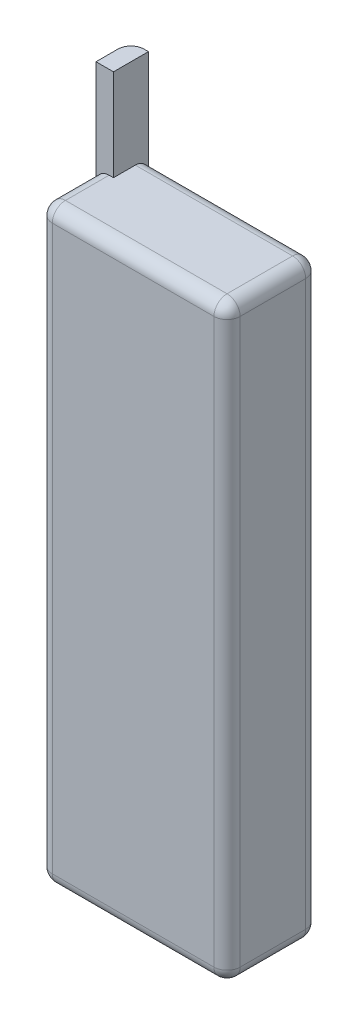
ISO-10303-21;
HEADER;
FILE_DESCRIPTION(('STEP AP214'),'2;1');
FILE_NAME('part.step','',(''),(''),'','','');
FILE_SCHEMA(('AUTOMOTIVE_DESIGN { 1 0 10303 214 1 1 1 1 }'));
ENDSEC;
DATA;
#1=APPLICATION_CONTEXT('core data for automotive mechanical design processes');
#2=APPLICATION_PROTOCOL_DEFINITION('international standard','automotive_design',2000,#1);
#3=PRODUCT_CONTEXT('',#1,'mechanical');
#4=PRODUCT('Part','Part','',(#3));
#5=PRODUCT_RELATED_PRODUCT_CATEGORY('part','',(#4));
#6=PRODUCT_DEFINITION_FORMATION('','',#4);
#7=PRODUCT_DEFINITION_CONTEXT('part definition',#1,'design');
#8=PRODUCT_DEFINITION('design','',#6,#7);
#9=PRODUCT_DEFINITION_SHAPE('','',#8);
#10=(LENGTH_UNIT() NAMED_UNIT(*) SI_UNIT(.MILLI.,.METRE.));
#11=(NAMED_UNIT(*) PLANE_ANGLE_UNIT() SI_UNIT($,.RADIAN.));
#12=(NAMED_UNIT(*) SI_UNIT($,.STERADIAN.) SOLID_ANGLE_UNIT());
#13=UNCERTAINTY_MEASURE_WITH_UNIT(LENGTH_MEASURE(1.E-05),#10,'distance_accuracy_value','');
#14=(GEOMETRIC_REPRESENTATION_CONTEXT(3) GLOBAL_UNCERTAINTY_ASSIGNED_CONTEXT((#13)) GLOBAL_UNIT_ASSIGNED_CONTEXT((#10,
#11,#12)) REPRESENTATION_CONTEXT('',''));
#15=CARTESIAN_POINT('',(0.,0.,0.));
#16=DIRECTION('',(0.,0.,1.));
#17=DIRECTION('',(1.,0.,0.));
#18=AXIS2_PLACEMENT_3D('',#15,#16,#17);
#19=CARTESIAN_POINT('',(0.,135.,21.));
#20=DIRECTION('',(0.,-1.,0.));
#21=DIRECTION('',(0.,0.,-1.));
#22=AXIS2_PLACEMENT_3D('',#19,#20,#21);
#23=PLANE('',#22);
#24=DIRECTION('',(0.,0.,-1.));
#25=VECTOR('',#24,1.);
#26=CARTESIAN_POINT('',(40.,135.,21.));
#27=LINE('',#26,#25);
#28=CARTESIAN_POINT('',(40.,135.,18.));
#29=VERTEX_POINT('',#28);
#30=CARTESIAN_POINT('',(40.,135.,3.));
#31=VERTEX_POINT('',#30);
#32=EDGE_CURVE('E301',#29,#31,#27,.T.);
#33=ORIENTED_EDGE('',*,*,#32,.T.);
#34=DIRECTION('',(-1.,0.,0.));
#35=VECTOR('',#34,1.);
#36=CARTESIAN_POINT('',(4.,135.,3.));
#37=LINE('',#36,#35);
#38=CARTESIAN_POINT('',(4.,135.,3.));
#39=VERTEX_POINT('',#38);
#40=EDGE_CURVE('E304',#31,#39,#37,.T.);
#41=ORIENTED_EDGE('',*,*,#40,.T.);
#42=DIRECTION('',(0.,0.,-1.));
#43=VECTOR('',#42,1.);
#44=CARTESIAN_POINT('',(4.,135.,0.));
#45=LINE('',#44,#43);
#46=CARTESIAN_POINT('',(4.,135.,8.));
#47=VERTEX_POINT('',#46);
#48=EDGE_CURVE('E164',#47,#39,#45,.T.);
#49=ORIENTED_EDGE('',*,*,#48,.F.);
#50=DIRECTION('',(1.,0.,0.));
#51=VECTOR('',#50,1.);
#52=CARTESIAN_POINT('',(0.,135.,8.));
#53=LINE('',#52,#51);
#54=CARTESIAN_POINT('',(3.,135.,8.));
#55=VERTEX_POINT('',#54);
#56=EDGE_CURVE('E285',#55,#47,#53,.T.);
#57=ORIENTED_EDGE('',*,*,#56,.F.);
#58=DIRECTION('',(0.,0.,-1.));
#59=VECTOR('',#58,1.);
#60=CARTESIAN_POINT('',(3.,135.,21.));
#61=LINE('',#60,#59);
#62=CARTESIAN_POINT('',(3.,135.,18.));
#63=VERTEX_POINT('',#62);
#64=EDGE_CURVE('E298',#55,#63,#61,.F.);
#65=ORIENTED_EDGE('',*,*,#64,.T.);
#66=DIRECTION('',(-1.,0.,0.));
#67=VECTOR('',#66,1.);
#68=CARTESIAN_POINT('',(0.,135.,18.));
#69=LINE('',#68,#67);
#70=EDGE_CURVE('E295',#63,#29,#69,.F.);
#71=ORIENTED_EDGE('',*,*,#70,.T.);
#72=EDGE_LOOP('',(#33,#41,#49,#57,#65,#71));
#73=FACE_BOUND('',#72,.T.);
#74=ADVANCED_FACE('F41',(#73),#23,.F.);
#75=CARTESIAN_POINT('',(0.,0.,21.));
#76=DIRECTION('',(1.,0.,0.));
#77=DIRECTION('',(0.,0.,-1.));
#78=AXIS2_PLACEMENT_3D('',#75,#76,#77);
#79=PLANE('',#78);
#80=DIRECTION('',(0.,-1.,0.));
#81=VECTOR('',#80,1.);
#82=CARTESIAN_POINT('',(0.,0.,18.));
#83=LINE('',#82,#81);
#84=CARTESIAN_POINT('',(0.,3.,18.));
#85=VERTEX_POINT('',#84);
#86=CARTESIAN_POINT('',(0.,132.,18.));
#87=VERTEX_POINT('',#86);
#88=EDGE_CURVE('E197',#85,#87,#83,.F.);
#89=ORIENTED_EDGE('',*,*,#88,.T.);
#90=DIRECTION('',(0.,0.,-1.));
#91=VECTOR('',#90,1.);
#92=CARTESIAN_POINT('',(0.,132.,21.));
#93=LINE('',#92,#91);
#94=CARTESIAN_POINT('',(0.,132.,8.));
#95=VERTEX_POINT('',#94);
#96=EDGE_CURVE('E176',#87,#95,#93,.T.);
#97=ORIENTED_EDGE('',*,*,#96,.T.);
#98=DIRECTION('',(0.,-1.,0.));
#99=VECTOR('',#98,1.);
#100=CARTESIAN_POINT('',(0.,156.,8.));
#101=LINE('',#100,#99);
#102=CARTESIAN_POINT('',(0.,156.,8.));
#103=VERTEX_POINT('',#102);
#104=EDGE_CURVE('E58',#103,#95,#101,.T.);
#105=ORIENTED_EDGE('',*,*,#104,.F.);
#106=DIRECTION('',(0.,0.,1.));
#107=VECTOR('',#106,1.);
#108=CARTESIAN_POINT('',(0.,156.,0.));
#109=LINE('',#108,#107);
#110=CARTESIAN_POINT('',(0.,156.,3.));
#111=VERTEX_POINT('',#110);
#112=EDGE_CURVE('E154',#111,#103,#109,.T.);
#113=ORIENTED_EDGE('',*,*,#112,.F.);
#114=DIRECTION('',(0.,-1.,0.));
#115=VECTOR('',#114,1.);
#116=CARTESIAN_POINT('',(0.,0.,3.));
#117=LINE('',#116,#115);
#118=CARTESIAN_POINT('',(0.,3.,3.));
#119=VERTEX_POINT('',#118);
#120=EDGE_CURVE('E204',#111,#119,#117,.T.);
#121=ORIENTED_EDGE('',*,*,#120,.T.);
#122=DIRECTION('',(0.,0.,-1.));
#123=VECTOR('',#122,1.);
#124=CARTESIAN_POINT('',(0.,3.,21.));
#125=LINE('',#124,#123);
#126=EDGE_CURVE('E200',#119,#85,#125,.F.);
#127=ORIENTED_EDGE('',*,*,#126,.T.);
#128=EDGE_LOOP('',(#89,#97,#105,#113,#121,#127));
#129=FACE_BOUND('',#128,.T.);
#130=ADVANCED_FACE('F174',(#129),#79,.F.);
#131=CARTESIAN_POINT('',(0.,0.,21.));
#132=DIRECTION('',(0.,1.,0.));
#133=DIRECTION('',(0.,0.,1.));
#134=AXIS2_PLACEMENT_3D('',#131,#132,#133);
#135=PLANE('',#134);
#136=DIRECTION('',(1.,0.,0.));
#137=VECTOR('',#136,1.);
#138=CARTESIAN_POINT('',(0.,0.,18.));
#139=LINE('',#138,#137);
#140=CARTESIAN_POINT('',(40.,0.,18.));
#141=VERTEX_POINT('',#140);
#142=CARTESIAN_POINT('',(3.,0.,18.));
#143=VERTEX_POINT('',#142);
#144=EDGE_CURVE('E190',#141,#143,#139,.F.);
#145=ORIENTED_EDGE('',*,*,#144,.T.);
#146=DIRECTION('',(0.,0.,-1.));
#147=VECTOR('',#146,1.);
#148=CARTESIAN_POINT('',(3.,0.,21.));
#149=LINE('',#148,#147);
#150=CARTESIAN_POINT('',(3.,0.,3.));
#151=VERTEX_POINT('',#150);
#152=EDGE_CURVE('E193',#143,#151,#149,.T.);
#153=ORIENTED_EDGE('',*,*,#152,.T.);
#154=DIRECTION('',(1.,0.,0.));
#155=VECTOR('',#154,1.);
#156=CARTESIAN_POINT('',(43.,0.,3.));
#157=LINE('',#156,#155);
#158=CARTESIAN_POINT('',(40.,0.,3.));
#159=VERTEX_POINT('',#158);
#160=EDGE_CURVE('E179',#151,#159,#157,.T.);
#161=ORIENTED_EDGE('',*,*,#160,.T.);
#162=DIRECTION('',(0.,0.,-1.));
#163=VECTOR('',#162,1.);
#164=CARTESIAN_POINT('',(40.,0.,21.));
#165=LINE('',#164,#163);
#166=EDGE_CURVE('E183',#159,#141,#165,.F.);
#167=ORIENTED_EDGE('',*,*,#166,.T.);
#168=EDGE_LOOP('',(#145,#153,#161,#167));
#169=FACE_BOUND('',#168,.T.);
#170=ADVANCED_FACE('F452',(#169),#135,.F.);
#171=CARTESIAN_POINT('',(43.,0.,21.));
#172=DIRECTION('',(-1.,0.,0.));
#173=DIRECTION('',(0.,0.,1.));
#174=AXIS2_PLACEMENT_3D('',#171,#172,#173);
#175=PLANE('',#174);
#176=DIRECTION('',(0.,1.,0.));
#177=VECTOR('',#176,1.);
#178=CARTESIAN_POINT('',(43.,135.,3.));
#179=LINE('',#178,#177);
#180=CARTESIAN_POINT('',(43.,3.,3.));
#181=VERTEX_POINT('',#180);
#182=CARTESIAN_POINT('',(43.,132.,3.));
#183=VERTEX_POINT('',#182);
#184=EDGE_CURVE('E223',#181,#183,#179,.T.);
#185=ORIENTED_EDGE('',*,*,#184,.T.);
#186=DIRECTION('',(0.,0.,-1.));
#187=VECTOR('',#186,1.);
#188=CARTESIAN_POINT('',(43.,132.,21.));
#189=LINE('',#188,#187);
#190=CARTESIAN_POINT('',(43.,132.,18.));
#191=VERTEX_POINT('',#190);
#192=EDGE_CURVE('E310',#183,#191,#189,.F.);
#193=ORIENTED_EDGE('',*,*,#192,.T.);
#194=DIRECTION('',(0.,1.,0.));
#195=VECTOR('',#194,1.);
#196=CARTESIAN_POINT('',(43.,0.,18.));
#197=LINE('',#196,#195);
#198=CARTESIAN_POINT('',(43.,3.,18.));
#199=VERTEX_POINT('',#198);
#200=EDGE_CURVE('E217',#191,#199,#197,.F.);
#201=ORIENTED_EDGE('',*,*,#200,.T.);
#202=DIRECTION('',(0.,0.,-1.));
#203=VECTOR('',#202,1.);
#204=CARTESIAN_POINT('',(43.,3.,21.));
#205=LINE('',#204,#203);
#206=EDGE_CURVE('E220',#199,#181,#205,.T.);
#207=ORIENTED_EDGE('',*,*,#206,.T.);
#208=EDGE_LOOP('',(#185,#193,#201,#207));
#209=FACE_BOUND('',#208,.T.);
#210=ADVANCED_FACE('F431',(#209),#175,.F.);
#211=CARTESIAN_POINT('',(0.,0.,21.));
#212=DIRECTION('',(0.,0.,-1.));
#213=DIRECTION('',(-1.,0.,0.));
#214=AXIS2_PLACEMENT_3D('',#211,#212,#213);
#215=PLANE('',#214);
#216=DIRECTION('',(0.,1.,0.));
#217=VECTOR('',#216,1.);
#218=CARTESIAN_POINT('',(40.,0.,21.));
#219=LINE('',#218,#217);
#220=CARTESIAN_POINT('',(40.,3.,21.));
#221=VERTEX_POINT('',#220);
#222=CARTESIAN_POINT('',(40.,132.,21.));
#223=VERTEX_POINT('',#222);
#224=EDGE_CURVE('E207',#221,#223,#219,.T.);
#225=ORIENTED_EDGE('',*,*,#224,.T.);
#226=DIRECTION('',(-1.,0.,0.));
#227=VECTOR('',#226,1.);
#228=CARTESIAN_POINT('',(0.,132.,21.));
#229=LINE('',#228,#227);
#230=CARTESIAN_POINT('',(3.,132.,21.));
#231=VERTEX_POINT('',#230);
#232=EDGE_CURVE('E315',#223,#231,#229,.T.);
#233=ORIENTED_EDGE('',*,*,#232,.T.);
#234=DIRECTION('',(0.,-1.,0.));
#235=VECTOR('',#234,1.);
#236=CARTESIAN_POINT('',(3.,0.,21.));
#237=LINE('',#236,#235);
#238=CARTESIAN_POINT('',(3.,3.,21.));
#239=VERTEX_POINT('',#238);
#240=EDGE_CURVE('E214',#231,#239,#237,.T.);
#241=ORIENTED_EDGE('',*,*,#240,.T.);
#242=DIRECTION('',(1.,0.,0.));
#243=VECTOR('',#242,1.);
#244=CARTESIAN_POINT('',(0.,3.,21.));
#245=LINE('',#244,#243);
#246=EDGE_CURVE('E211',#239,#221,#245,.T.);
#247=ORIENTED_EDGE('',*,*,#246,.T.);
#248=EDGE_LOOP('',(#225,#233,#241,#247));
#249=FACE_BOUND('',#248,.T.);
#250=ADVANCED_FACE('F392',(#249),#215,.F.);
#251=CARTESIAN_POINT('',(0.,0.,0.));
#252=DIRECTION('',(0.,0.,-1.));
#253=DIRECTION('',(-1.,0.,0.));
#254=AXIS2_PLACEMENT_3D('',#251,#252,#253);
#255=PLANE('',#254);
#256=DIRECTION('',(0.,-1.,0.));
#257=VECTOR('',#256,1.);
#258=CARTESIAN_POINT('',(4.,156.,0.));
#259=LINE('',#258,#257);
#260=CARTESIAN_POINT('',(4.,156.,0.));
#261=VERTEX_POINT('',#260);
#262=CARTESIAN_POINT('',(4.,132.,0.));
#263=VERTEX_POINT('',#262);
#264=EDGE_CURVE('E66',#261,#263,#259,.T.);
#265=ORIENTED_EDGE('',*,*,#264,.T.);
#266=DIRECTION('',(-1.,0.,0.));
#267=VECTOR('',#266,1.);
#268=CARTESIAN_POINT('',(40.,132.,0.));
#269=LINE('',#268,#267);
#270=CARTESIAN_POINT('',(40.,132.,0.));
#271=VERTEX_POINT('',#270);
#272=EDGE_CURVE('E307',#263,#271,#269,.F.);
#273=ORIENTED_EDGE('',*,*,#272,.T.);
#274=DIRECTION('',(0.,1.,0.));
#275=VECTOR('',#274,1.);
#276=CARTESIAN_POINT('',(40.,0.,0.));
#277=LINE('',#276,#275);
#278=CARTESIAN_POINT('',(40.,3.,0.));
#279=VERTEX_POINT('',#278);
#280=EDGE_CURVE('E227',#271,#279,#277,.F.);
#281=ORIENTED_EDGE('',*,*,#280,.T.);
#282=DIRECTION('',(1.,0.,0.));
#283=VECTOR('',#282,1.);
#284=CARTESIAN_POINT('',(0.,3.,0.));
#285=LINE('',#284,#283);
#286=CARTESIAN_POINT('',(3.,3.,0.));
#287=VERTEX_POINT('',#286);
#288=EDGE_CURVE('E230',#279,#287,#285,.F.);
#289=ORIENTED_EDGE('',*,*,#288,.T.);
#290=DIRECTION('',(0.,-1.,0.));
#291=VECTOR('',#290,1.);
#292=CARTESIAN_POINT('',(3.,156.,0.));
#293=LINE('',#292,#291);
#294=CARTESIAN_POINT('',(3.,156.,0.));
#295=VERTEX_POINT('',#294);
#296=EDGE_CURVE('E233',#287,#295,#293,.F.);
#297=ORIENTED_EDGE('',*,*,#296,.T.);
#298=DIRECTION('',(-1.,0.,0.));
#299=VECTOR('',#298,1.);
#300=CARTESIAN_POINT('',(0.,156.,0.));
#301=LINE('',#300,#299);
#302=EDGE_CURVE('E358',#261,#295,#301,.T.);
#303=ORIENTED_EDGE('',*,*,#302,.F.);
#304=EDGE_LOOP('',(#265,#273,#281,#289,#297,#303));
#305=FACE_BOUND('',#304,.T.);
#306=ADVANCED_FACE('F367',(#305),#255,.T.);
#307=CARTESIAN_POINT('',(0.,156.,8.));
#308=DIRECTION('',(0.,0.,-1.));
#309=DIRECTION('',(-1.,0.,0.));
#310=AXIS2_PLACEMENT_3D('',#307,#308,#309);
#311=PLANE('',#310);
#312=ORIENTED_EDGE('',*,*,#104,.T.);
#313=CARTESIAN_POINT('',(3.,132.,8.));
#314=DIRECTION('',(0.,0.,-1.));
#315=DIRECTION('',(-1.,0.,0.));
#316=AXIS2_PLACEMENT_3D('',#313,#314,#315);
#317=CIRCLE('',#316,3.);
#318=EDGE_CURVE('E11',#95,#55,#317,.T.);
#319=ORIENTED_EDGE('',*,*,#318,.T.);
#320=ORIENTED_EDGE('',*,*,#56,.T.);
#321=DIRECTION('',(0.,-1.,0.));
#322=VECTOR('',#321,1.);
#323=CARTESIAN_POINT('',(4.,156.,8.));
#324=LINE('',#323,#322);
#325=CARTESIAN_POINT('',(4.,156.,8.));
#326=VERTEX_POINT('',#325);
#327=EDGE_CURVE('E168',#326,#47,#324,.T.);
#328=ORIENTED_EDGE('',*,*,#327,.F.);
#329=DIRECTION('',(1.,0.,0.));
#330=VECTOR('',#329,1.);
#331=CARTESIAN_POINT('',(0.,156.,8.));
#332=LINE('',#331,#330);
#333=EDGE_CURVE('E157',#103,#326,#332,.T.);
#334=ORIENTED_EDGE('',*,*,#333,.F.);
#335=EDGE_LOOP('',(#312,#319,#320,#328,#334));
#336=FACE_BOUND('',#335,.T.);
#337=ADVANCED_FACE('F166',(#336),#311,.F.);
#338=CARTESIAN_POINT('',(4.,156.,0.));
#339=DIRECTION('',(-1.,0.,0.));
#340=DIRECTION('',(0.,0.,1.));
#341=AXIS2_PLACEMENT_3D('',#338,#339,#340);
#342=PLANE('',#341);
#343=ORIENTED_EDGE('',*,*,#48,.T.);
#344=CARTESIAN_POINT('',(4.,132.,3.));
#345=DIRECTION('',(-1.,0.,0.));
#346=DIRECTION('',(0.,0.,1.));
#347=AXIS2_PLACEMENT_3D('',#344,#345,#346);
#348=CIRCLE('',#347,3.);
#349=EDGE_CURVE('E51',#39,#263,#348,.T.);
#350=ORIENTED_EDGE('',*,*,#349,.T.);
#351=ORIENTED_EDGE('',*,*,#264,.F.);
#352=DIRECTION('',(0.,0.,-1.));
#353=VECTOR('',#352,1.);
#354=CARTESIAN_POINT('',(4.,156.,0.));
#355=LINE('',#354,#353);
#356=EDGE_CURVE('E171',#326,#261,#355,.T.);
#357=ORIENTED_EDGE('',*,*,#356,.F.);
#358=ORIENTED_EDGE('',*,*,#327,.T.);
#359=EDGE_LOOP('',(#343,#350,#351,#357,#358));
#360=FACE_BOUND('',#359,.T.);
#361=ADVANCED_FACE('F364',(#360),#342,.F.);
#362=CARTESIAN_POINT('',(0.,156.,0.));
#363=DIRECTION('',(0.,1.,0.));
#364=DIRECTION('',(0.,0.,1.));
#365=AXIS2_PLACEMENT_3D('',#362,#363,#364);
#366=PLANE('',#365);
#367=ORIENTED_EDGE('',*,*,#302,.T.);
#368=CARTESIAN_POINT('',(3.,156.,3.));
#369=DIRECTION('',(0.,1.,0.));
#370=DIRECTION('',(0.,0.,1.));
#371=AXIS2_PLACEMENT_3D('',#368,#369,#370);
#372=CIRCLE('',#371,3.);
#373=EDGE_CURVE('E160',#295,#111,#372,.T.);
#374=ORIENTED_EDGE('',*,*,#373,.T.);
#375=ORIENTED_EDGE('',*,*,#112,.T.);
#376=ORIENTED_EDGE('',*,*,#333,.T.);
#377=ORIENTED_EDGE('',*,*,#356,.T.);
#378=EDGE_LOOP('',(#367,#374,#375,#376,#377));
#379=FACE_BOUND('',#378,.T.);
#380=ADVANCED_FACE('F156',(#379),#366,.T.);
#381=CARTESIAN_POINT('',(40.,0.,18.));
#382=DIRECTION('',(0.,1.,0.));
#383=DIRECTION('',(0.,0.,1.));
#384=AXIS2_PLACEMENT_3D('',#381,#382,#383);
#385=CYLINDRICAL_SURFACE('',#384,3.);
#386=ORIENTED_EDGE('',*,*,#200,.F.);
#387=CARTESIAN_POINT('',(40.,132.,18.));
#388=DIRECTION('',(0.,1.,0.));
#389=DIRECTION('',(0.,0.,1.));
#390=AXIS2_PLACEMENT_3D('',#387,#388,#389);
#391=CIRCLE('',#390,3.);
#392=EDGE_CURVE('E289',#191,#223,#391,.F.);
#393=ORIENTED_EDGE('',*,*,#392,.T.);
#394=ORIENTED_EDGE('',*,*,#224,.F.);
#395=CARTESIAN_POINT('',(40.,3.,18.));
#396=DIRECTION('',(0.,-1.,0.));
#397=DIRECTION('',(0.,0.,-1.));
#398=AXIS2_PLACEMENT_3D('',#395,#396,#397);
#399=CIRCLE('',#398,3.);
#400=EDGE_CURVE('E281',#199,#221,#399,.T.);
#401=ORIENTED_EDGE('',*,*,#400,.F.);
#402=EDGE_LOOP('',(#386,#393,#394,#401));
#403=FACE_BOUND('',#402,.T.);
#404=ADVANCED_FACE('F405',(#403),#385,.T.);
#405=CARTESIAN_POINT('',(40.,3.,21.));
#406=DIRECTION('',(0.,0.,-1.));
#407=DIRECTION('',(-1.,0.,0.));
#408=AXIS2_PLACEMENT_3D('',#405,#406,#407);
#409=CYLINDRICAL_SURFACE('',#408,3.);
#410=CARTESIAN_POINT('',(40.,3.,3.));
#411=DIRECTION('',(0.,0.,-1.));
#412=DIRECTION('',(-1.,0.,0.));
#413=AXIS2_PLACEMENT_3D('',#410,#411,#412);
#414=CIRCLE('',#413,3.);
#415=EDGE_CURVE('E273',#181,#159,#414,.T.);
#416=ORIENTED_EDGE('',*,*,#415,.F.);
#417=ORIENTED_EDGE('',*,*,#206,.F.);
#418=CARTESIAN_POINT('',(40.,3.,18.));
#419=DIRECTION('',(0.,0.,1.));
#420=DIRECTION('',(1.,0.,0.));
#421=AXIS2_PLACEMENT_3D('',#418,#419,#420);
#422=CIRCLE('',#421,3.);
#423=EDGE_CURVE('E277',#141,#199,#422,.T.);
#424=ORIENTED_EDGE('',*,*,#423,.F.);
#425=ORIENTED_EDGE('',*,*,#166,.F.);
#426=EDGE_LOOP('',(#416,#417,#424,#425));
#427=FACE_BOUND('',#426,.T.);
#428=ADVANCED_FACE('F436',(#427),#409,.T.);
#429=CARTESIAN_POINT('',(40.,0.,3.));
#430=DIRECTION('',(0.,-1.,0.));
#431=DIRECTION('',(0.,0.,-1.));
#432=AXIS2_PLACEMENT_3D('',#429,#430,#431);
#433=CYLINDRICAL_SURFACE('',#432,3.);
#434=ORIENTED_EDGE('',*,*,#280,.F.);
#435=CARTESIAN_POINT('',(40.,132.,3.));
#436=DIRECTION('',(0.,-1.,0.));
#437=DIRECTION('',(0.,0.,-1.));
#438=AXIS2_PLACEMENT_3D('',#435,#436,#437);
#439=CIRCLE('',#438,3.);
#440=EDGE_CURVE('E238',#271,#183,#439,.T.);
#441=ORIENTED_EDGE('',*,*,#440,.T.);
#442=ORIENTED_EDGE('',*,*,#184,.F.);
#443=CARTESIAN_POINT('',(40.,3.,3.));
#444=DIRECTION('',(0.,-1.,0.));
#445=DIRECTION('',(0.,0.,-1.));
#446=AXIS2_PLACEMENT_3D('',#443,#444,#445);
#447=CIRCLE('',#446,3.);
#448=EDGE_CURVE('E269',#279,#181,#447,.T.);
#449=ORIENTED_EDGE('',*,*,#448,.F.);
#450=EDGE_LOOP('',(#434,#441,#442,#449));
#451=FACE_BOUND('',#450,.T.);
#452=ADVANCED_FACE('F425',(#451),#433,.T.);
#453=CARTESIAN_POINT('',(40.,3.,18.));
#454=DIRECTION('',(0.,0.,1.));
#455=DIRECTION('',(1.,0.,0.));
#456=AXIS2_PLACEMENT_3D('',#453,#454,#455);
#457=SPHERICAL_SURFACE('',#456,3.);
#458=ORIENTED_EDGE('',*,*,#423,.T.);
#459=ORIENTED_EDGE('',*,*,#400,.T.);
#460=CARTESIAN_POINT('',(40.,3.,18.));
#461=DIRECTION('',(1.,0.,0.));
#462=DIRECTION('',(0.,0.,-1.));
#463=AXIS2_PLACEMENT_3D('',#460,#461,#462);
#464=CIRCLE('',#463,3.);
#465=EDGE_CURVE('E265',#141,#221,#464,.F.);
#466=ORIENTED_EDGE('',*,*,#465,.F.);
#467=EDGE_LOOP('',(#458,#459,#466));
#468=FACE_BOUND('',#467,.T.);
#469=ADVANCED_FACE('F400',(#468),#457,.T.);
#470=CARTESIAN_POINT('',(40.,3.,3.));
#471=DIRECTION('',(0.,0.,1.));
#472=DIRECTION('',(1.,0.,0.));
#473=AXIS2_PLACEMENT_3D('',#470,#471,#472);
#474=SPHERICAL_SURFACE('',#473,3.);
#475=ORIENTED_EDGE('',*,*,#448,.T.);
#476=ORIENTED_EDGE('',*,*,#415,.T.);
#477=CARTESIAN_POINT('',(40.,3.,3.));
#478=DIRECTION('',(1.,0.,0.));
#479=DIRECTION('',(0.,0.,-1.));
#480=AXIS2_PLACEMENT_3D('',#477,#478,#479);
#481=CIRCLE('',#480,3.);
#482=EDGE_CURVE('E261',#279,#159,#481,.F.);
#483=ORIENTED_EDGE('',*,*,#482,.F.);
#484=EDGE_LOOP('',(#475,#476,#483));
#485=FACE_BOUND('',#484,.T.);
#486=ADVANCED_FACE('F438',(#485),#474,.T.);
#487=CARTESIAN_POINT('',(3.,0.,18.));
#488=DIRECTION('',(0.,-1.,0.));
#489=DIRECTION('',(0.,0.,-1.));
#490=AXIS2_PLACEMENT_3D('',#487,#488,#489);
#491=CYLINDRICAL_SURFACE('',#490,3.);
#492=ORIENTED_EDGE('',*,*,#240,.F.);
#493=CARTESIAN_POINT('',(3.,132.,18.));
#494=DIRECTION('',(0.,-1.,0.));
#495=DIRECTION('',(0.,0.,-1.));
#496=AXIS2_PLACEMENT_3D('',#493,#494,#495);
#497=CIRCLE('',#496,3.);
#498=EDGE_CURVE('E292',#231,#87,#497,.T.);
#499=ORIENTED_EDGE('',*,*,#498,.T.);
#500=ORIENTED_EDGE('',*,*,#88,.F.);
#501=CARTESIAN_POINT('',(3.,3.,18.));
#502=DIRECTION('',(0.,-1.,0.));
#503=DIRECTION('',(0.,0.,-1.));
#504=AXIS2_PLACEMENT_3D('',#501,#502,#503);
#505=CIRCLE('',#504,3.);
#506=EDGE_CURVE('E257',#239,#85,#505,.T.);
#507=ORIENTED_EDGE('',*,*,#506,.F.);
#508=EDGE_LOOP('',(#492,#499,#500,#507));
#509=FACE_BOUND('',#508,.T.);
#510=ADVANCED_FACE('F389',(#509),#491,.T.);
#511=CARTESIAN_POINT('',(0.,3.,18.));
#512=DIRECTION('',(1.,0.,0.));
#513=DIRECTION('',(0.,0.,-1.));
#514=AXIS2_PLACEMENT_3D('',#511,#512,#513);
#515=CYLINDRICAL_SURFACE('',#514,3.);
#516=ORIENTED_EDGE('',*,*,#465,.T.);
#517=ORIENTED_EDGE('',*,*,#246,.F.);
#518=CARTESIAN_POINT('',(3.,3.,18.));
#519=DIRECTION('',(-1.,0.,0.));
#520=DIRECTION('',(0.,0.,1.));
#521=AXIS2_PLACEMENT_3D('',#518,#519,#520);
#522=CIRCLE('',#521,3.);
#523=EDGE_CURVE('E253',#143,#239,#522,.T.);
#524=ORIENTED_EDGE('',*,*,#523,.F.);
#525=ORIENTED_EDGE('',*,*,#144,.F.);
#526=EDGE_LOOP('',(#516,#517,#524,#525));
#527=FACE_BOUND('',#526,.T.);
#528=ADVANCED_FACE('F396',(#527),#515,.T.);
#529=CARTESIAN_POINT('',(0.,3.,3.));
#530=DIRECTION('',(-1.,0.,0.));
#531=DIRECTION('',(0.,0.,1.));
#532=AXIS2_PLACEMENT_3D('',#529,#530,#531);
#533=CYLINDRICAL_SURFACE('',#532,3.);
#534=ORIENTED_EDGE('',*,*,#482,.T.);
#535=ORIENTED_EDGE('',*,*,#160,.F.);
#536=CARTESIAN_POINT('',(3.,3.,3.));
#537=DIRECTION('',(-1.,0.,0.));
#538=DIRECTION('',(0.,0.,1.));
#539=AXIS2_PLACEMENT_3D('',#536,#537,#538);
#540=CIRCLE('',#539,3.);
#541=EDGE_CURVE('E249',#287,#151,#540,.T.);
#542=ORIENTED_EDGE('',*,*,#541,.F.);
#543=ORIENTED_EDGE('',*,*,#288,.F.);
#544=EDGE_LOOP('',(#534,#535,#542,#543));
#545=FACE_BOUND('',#544,.T.);
#546=ADVANCED_FACE('F377',(#545),#533,.T.);
#547=CARTESIAN_POINT('',(3.,0.,3.));
#548=DIRECTION('',(0.,1.,0.));
#549=DIRECTION('',(0.,0.,1.));
#550=AXIS2_PLACEMENT_3D('',#547,#548,#549);
#551=CYLINDRICAL_SURFACE('',#550,3.);
#552=ORIENTED_EDGE('',*,*,#373,.F.);
#553=ORIENTED_EDGE('',*,*,#296,.F.);
#554=CARTESIAN_POINT('',(3.,3.,3.));
#555=DIRECTION('',(0.,-1.,0.));
#556=DIRECTION('',(0.,0.,-1.));
#557=AXIS2_PLACEMENT_3D('',#554,#555,#556);
#558=CIRCLE('',#557,3.);
#559=EDGE_CURVE('E245',#119,#287,#558,.T.);
#560=ORIENTED_EDGE('',*,*,#559,.F.);
#561=ORIENTED_EDGE('',*,*,#120,.F.);
#562=EDGE_LOOP('',(#552,#553,#560,#561));
#563=FACE_BOUND('',#562,.T.);
#564=ADVANCED_FACE('F373',(#563),#551,.T.);
#565=CARTESIAN_POINT('',(3.,3.,18.));
#566=DIRECTION('',(0.,0.,1.));
#567=DIRECTION('',(1.,0.,0.));
#568=AXIS2_PLACEMENT_3D('',#565,#566,#567);
#569=SPHERICAL_SURFACE('',#568,3.);
#570=ORIENTED_EDGE('',*,*,#523,.T.);
#571=ORIENTED_EDGE('',*,*,#506,.T.);
#572=CARTESIAN_POINT('',(3.,3.,18.));
#573=DIRECTION('',(0.,0.,1.));
#574=DIRECTION('',(1.,0.,0.));
#575=AXIS2_PLACEMENT_3D('',#572,#573,#574);
#576=CIRCLE('',#575,3.);
#577=EDGE_CURVE('E242',#143,#85,#576,.F.);
#578=ORIENTED_EDGE('',*,*,#577,.F.);
#579=EDGE_LOOP('',(#570,#571,#578));
#580=FACE_BOUND('',#579,.T.);
#581=ADVANCED_FACE('F466',(#580),#569,.T.);
#582=CARTESIAN_POINT('',(3.,3.,3.));
#583=DIRECTION('',(0.,0.,1.));
#584=DIRECTION('',(1.,0.,0.));
#585=AXIS2_PLACEMENT_3D('',#582,#583,#584);
#586=SPHERICAL_SURFACE('',#585,3.);
#587=ORIENTED_EDGE('',*,*,#559,.T.);
#588=ORIENTED_EDGE('',*,*,#541,.T.);
#589=CARTESIAN_POINT('',(3.,3.,3.));
#590=DIRECTION('',(0.,0.,-1.));
#591=DIRECTION('',(-1.,0.,0.));
#592=AXIS2_PLACEMENT_3D('',#589,#590,#591);
#593=CIRCLE('',#592,3.);
#594=EDGE_CURVE('E239',#119,#151,#593,.F.);
#595=ORIENTED_EDGE('',*,*,#594,.F.);
#596=EDGE_LOOP('',(#587,#588,#595));
#597=FACE_BOUND('',#596,.T.);
#598=ADVANCED_FACE('F380',(#597),#586,.T.);
#599=CARTESIAN_POINT('',(3.,3.,21.));
#600=DIRECTION('',(0.,0.,-1.));
#601=DIRECTION('',(-1.,0.,0.));
#602=AXIS2_PLACEMENT_3D('',#599,#600,#601);
#603=CYLINDRICAL_SURFACE('',#602,3.);
#604=ORIENTED_EDGE('',*,*,#577,.T.);
#605=ORIENTED_EDGE('',*,*,#126,.F.);
#606=ORIENTED_EDGE('',*,*,#594,.T.);
#607=ORIENTED_EDGE('',*,*,#152,.F.);
#608=EDGE_LOOP('',(#604,#605,#606,#607));
#609=FACE_BOUND('',#608,.T.);
#610=ADVANCED_FACE('F383',(#609),#603,.T.);
#611=CARTESIAN_POINT('',(3.,132.,21.));
#612=DIRECTION('',(0.,0.,-1.));
#613=DIRECTION('',(-1.,0.,0.));
#614=AXIS2_PLACEMENT_3D('',#611,#612,#613);
#615=CYLINDRICAL_SURFACE('',#614,3.);
#616=ORIENTED_EDGE('',*,*,#318,.F.);
#617=ORIENTED_EDGE('',*,*,#96,.F.);
#618=CARTESIAN_POINT('',(3.,132.,18.));
#619=DIRECTION('',(0.,0.,1.));
#620=DIRECTION('',(1.,0.,0.));
#621=AXIS2_PLACEMENT_3D('',#618,#619,#620);
#622=CIRCLE('',#621,3.);
#623=EDGE_CURVE('E45',#63,#87,#622,.T.);
#624=ORIENTED_EDGE('',*,*,#623,.F.);
#625=ORIENTED_EDGE('',*,*,#64,.F.);
#626=EDGE_LOOP('',(#616,#617,#624,#625));
#627=FACE_BOUND('',#626,.T.);
#628=ADVANCED_FACE('F43',(#627),#615,.T.);
#629=CARTESIAN_POINT('',(3.,132.,18.));
#630=DIRECTION('',(0.,-1.,0.));
#631=DIRECTION('',(0.,0.,-1.));
#632=AXIS2_PLACEMENT_3D('',#629,#630,#631);
#633=SPHERICAL_SURFACE('',#632,3.);
#634=ORIENTED_EDGE('',*,*,#623,.T.);
#635=ORIENTED_EDGE('',*,*,#498,.F.);
#636=CARTESIAN_POINT('',(3.,132.,18.));
#637=DIRECTION('',(1.,0.,0.));
#638=DIRECTION('',(0.,0.,-1.));
#639=AXIS2_PLACEMENT_3D('',#636,#637,#638);
#640=CIRCLE('',#639,3.);
#641=EDGE_CURVE('E334',#63,#231,#640,.T.);
#642=ORIENTED_EDGE('',*,*,#641,.F.);
#643=EDGE_LOOP('',(#634,#635,#642));
#644=FACE_BOUND('',#643,.T.);
#645=ADVANCED_FACE('F346',(#644),#633,.T.);
#646=CARTESIAN_POINT('',(0.,132.,18.));
#647=DIRECTION('',(-1.,0.,0.));
#648=DIRECTION('',(0.,0.,1.));
#649=AXIS2_PLACEMENT_3D('',#646,#647,#648);
#650=CYLINDRICAL_SURFACE('',#649,3.);
#651=ORIENTED_EDGE('',*,*,#641,.T.);
#652=ORIENTED_EDGE('',*,*,#232,.F.);
#653=CARTESIAN_POINT('',(40.,132.,18.));
#654=DIRECTION('',(1.,0.,0.));
#655=DIRECTION('',(0.,0.,-1.));
#656=AXIS2_PLACEMENT_3D('',#653,#654,#655);
#657=CIRCLE('',#656,3.);
#658=EDGE_CURVE('E331',#29,#223,#657,.T.);
#659=ORIENTED_EDGE('',*,*,#658,.F.);
#660=ORIENTED_EDGE('',*,*,#70,.F.);
#661=EDGE_LOOP('',(#651,#652,#659,#660));
#662=FACE_BOUND('',#661,.T.);
#663=ADVANCED_FACE('F408',(#662),#650,.T.);
#664=CARTESIAN_POINT('',(40.,132.,18.));
#665=DIRECTION('',(0.,-1.,0.));
#666=DIRECTION('',(0.,0.,-1.));
#667=AXIS2_PLACEMENT_3D('',#664,#665,#666);
#668=SPHERICAL_SURFACE('',#667,3.);
#669=ORIENTED_EDGE('',*,*,#658,.T.);
#670=ORIENTED_EDGE('',*,*,#392,.F.);
#671=CARTESIAN_POINT('',(40.,132.,18.));
#672=DIRECTION('',(0.,0.,-1.));
#673=DIRECTION('',(-1.,0.,0.));
#674=AXIS2_PLACEMENT_3D('',#671,#672,#673);
#675=CIRCLE('',#674,3.);
#676=EDGE_CURVE('E327',#29,#191,#675,.T.);
#677=ORIENTED_EDGE('',*,*,#676,.F.);
#678=EDGE_LOOP('',(#669,#670,#677));
#679=FACE_BOUND('',#678,.T.);
#680=ADVANCED_FACE('F411',(#679),#668,.T.);
#681=CARTESIAN_POINT('',(40.,132.,21.));
#682=DIRECTION('',(0.,0.,-1.));
#683=DIRECTION('',(-1.,0.,0.));
#684=AXIS2_PLACEMENT_3D('',#681,#682,#683);
#685=CYLINDRICAL_SURFACE('',#684,3.);
#686=ORIENTED_EDGE('',*,*,#676,.T.);
#687=ORIENTED_EDGE('',*,*,#192,.F.);
#688=CARTESIAN_POINT('',(40.,132.,3.));
#689=DIRECTION('',(0.,0.,-1.));
#690=DIRECTION('',(-1.,0.,0.));
#691=AXIS2_PLACEMENT_3D('',#688,#689,#690);
#692=CIRCLE('',#691,3.);
#693=EDGE_CURVE('E324',#31,#183,#692,.T.);
#694=ORIENTED_EDGE('',*,*,#693,.F.);
#695=ORIENTED_EDGE('',*,*,#32,.F.);
#696=EDGE_LOOP('',(#686,#687,#694,#695));
#697=FACE_BOUND('',#696,.T.);
#698=ADVANCED_FACE('F416',(#697),#685,.T.);
#699=CARTESIAN_POINT('',(0.,132.,3.));
#700=DIRECTION('',(1.,0.,0.));
#701=DIRECTION('',(0.,0.,-1.));
#702=AXIS2_PLACEMENT_3D('',#699,#700,#701);
#703=CYLINDRICAL_SURFACE('',#702,3.);
#704=ORIENTED_EDGE('',*,*,#349,.F.);
#705=ORIENTED_EDGE('',*,*,#40,.F.);
#706=CARTESIAN_POINT('',(40.,132.,3.));
#707=DIRECTION('',(1.,0.,0.));
#708=DIRECTION('',(0.,0.,-1.));
#709=AXIS2_PLACEMENT_3D('',#706,#707,#708);
#710=CIRCLE('',#709,3.);
#711=EDGE_CURVE('E320',#271,#31,#710,.T.);
#712=ORIENTED_EDGE('',*,*,#711,.F.);
#713=ORIENTED_EDGE('',*,*,#272,.F.);
#714=EDGE_LOOP('',(#704,#705,#712,#713));
#715=FACE_BOUND('',#714,.T.);
#716=ADVANCED_FACE('F420',(#715),#703,.T.);
#717=CARTESIAN_POINT('',(40.,132.,3.));
#718=DIRECTION('',(0.,-1.,0.));
#719=DIRECTION('',(0.,0.,-1.));
#720=AXIS2_PLACEMENT_3D('',#717,#718,#719);
#721=SPHERICAL_SURFACE('',#720,3.);
#722=ORIENTED_EDGE('',*,*,#693,.T.);
#723=ORIENTED_EDGE('',*,*,#440,.F.);
#724=ORIENTED_EDGE('',*,*,#711,.T.);
#725=EDGE_LOOP('',(#722,#723,#724));
#726=FACE_BOUND('',#725,.T.);
#727=ADVANCED_FACE('F429',(#726),#721,.T.);
#728=CLOSED_SHELL('',(#74,#130,#170,#210,#250,#306,#337,#361,#380,#404,#428,#452,#469,#486,#510,
#528,#546,#564,#581,#598,#610,#628,#645,#663,#680,#698,#716,#727));
#729=MANIFOLD_SOLID_BREP('B2',#728);
#730=ADVANCED_BREP_SHAPE_REPRESENTATION('',(#18,#729),#14);
#731=SHAPE_DEFINITION_REPRESENTATION(#9,#730);
ENDSEC;
END-ISO-10303-21;
